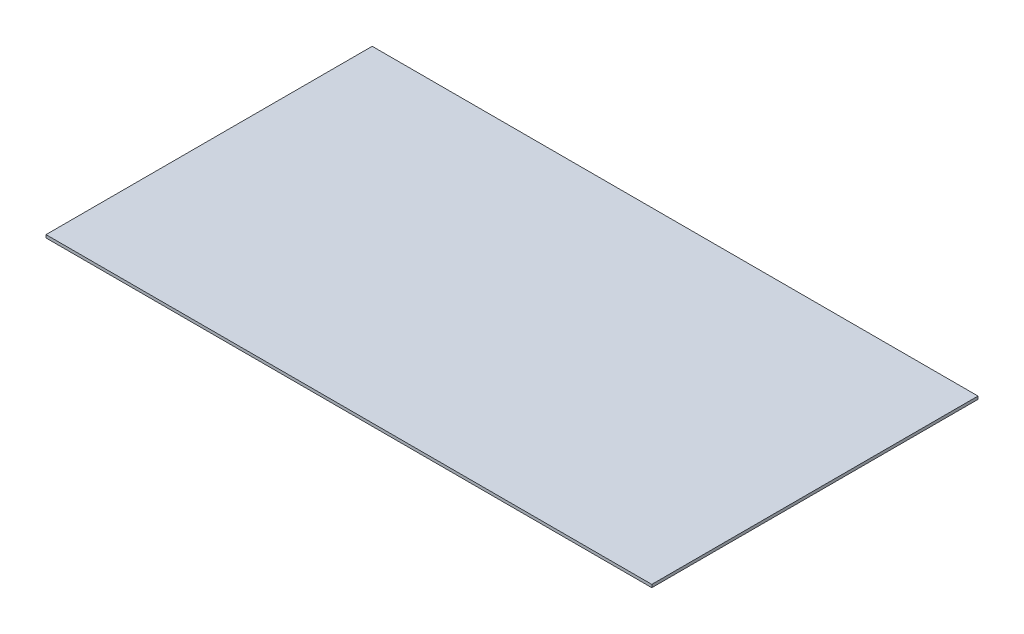
ISO-10303-21;
HEADER;
FILE_DESCRIPTION(('STEP AP214'),'2;1');
FILE_NAME('part.step','',(''),(''),'','','');
FILE_SCHEMA(('AUTOMOTIVE_DESIGN { 1 0 10303 214 1 1 1 1 }'));
ENDSEC;
DATA;
#1=APPLICATION_CONTEXT('core data for automotive mechanical design processes');
#2=APPLICATION_PROTOCOL_DEFINITION('international standard','automotive_design',2000,#1);
#3=PRODUCT_CONTEXT('',#1,'mechanical');
#4=PRODUCT('Part','Part','',(#3));
#5=PRODUCT_RELATED_PRODUCT_CATEGORY('part','',(#4));
#6=PRODUCT_DEFINITION_FORMATION('','',#4);
#7=PRODUCT_DEFINITION_CONTEXT('part definition',#1,'design');
#8=PRODUCT_DEFINITION('design','',#6,#7);
#9=PRODUCT_DEFINITION_SHAPE('','',#8);
#10=(LENGTH_UNIT() NAMED_UNIT(*) SI_UNIT(.MILLI.,.METRE.));
#11=(NAMED_UNIT(*) PLANE_ANGLE_UNIT() SI_UNIT($,.RADIAN.));
#12=(NAMED_UNIT(*) SI_UNIT($,.STERADIAN.) SOLID_ANGLE_UNIT());
#13=UNCERTAINTY_MEASURE_WITH_UNIT(LENGTH_MEASURE(1.E-05),#10,'distance_accuracy_value','');
#14=(GEOMETRIC_REPRESENTATION_CONTEXT(3) GLOBAL_UNCERTAINTY_ASSIGNED_CONTEXT((#13)) GLOBAL_UNIT_ASSIGNED_CONTEXT((#10,
#11,#12)) REPRESENTATION_CONTEXT('',''));
#15=CARTESIAN_POINT('',(0.,0.,0.));
#16=DIRECTION('',(0.,0.,1.));
#17=DIRECTION('',(1.,0.,0.));
#18=AXIS2_PLACEMENT_3D('',#15,#16,#17);
#19=CARTESIAN_POINT('',(0.,3.175,0.));
#20=DIRECTION('',(1.,0.,0.));
#21=DIRECTION('',(0.,0.,-1.));
#22=AXIS2_PLACEMENT_3D('',#19,#20,#21);
#23=PLANE('',#22);
#24=DIRECTION('',(0.,0.,1.));
#25=VECTOR('',#24,1.);
#26=CARTESIAN_POINT('',(0.,0.,0.));
#27=LINE('',#26,#25);
#28=CARTESIAN_POINT('',(0.,0.,-355.6));
#29=VERTEX_POINT('',#28);
#30=CARTESIAN_POINT('',(0.,0.,0.));
#31=VERTEX_POINT('',#30);
#32=EDGE_CURVE('E98',#29,#31,#27,.T.);
#33=ORIENTED_EDGE('',*,*,#32,.T.);
#34=DIRECTION('',(0.,-1.,0.));
#35=VECTOR('',#34,1.);
#36=CARTESIAN_POINT('',(0.,3.175,0.));
#37=LINE('',#36,#35);
#38=CARTESIAN_POINT('',(0.,3.175,0.));
#39=VERTEX_POINT('',#38);
#40=EDGE_CURVE('E11',#39,#31,#37,.T.);
#41=ORIENTED_EDGE('',*,*,#40,.F.);
#42=DIRECTION('',(0.,0.,1.));
#43=VECTOR('',#42,1.);
#44=CARTESIAN_POINT('',(0.,3.175,0.));
#45=LINE('',#44,#43);
#46=CARTESIAN_POINT('',(0.,3.175,-355.6));
#47=VERTEX_POINT('',#46);
#48=EDGE_CURVE('E86',#47,#39,#45,.T.);
#49=ORIENTED_EDGE('',*,*,#48,.F.);
#50=DIRECTION('',(0.,-1.,0.));
#51=VECTOR('',#50,1.);
#52=CARTESIAN_POINT('',(0.,3.175,-355.6));
#53=LINE('',#52,#51);
#54=EDGE_CURVE('E94',#47,#29,#53,.T.);
#55=ORIENTED_EDGE('',*,*,#54,.T.);
#56=EDGE_LOOP('',(#33,#41,#49,#55));
#57=FACE_BOUND('',#56,.T.);
#58=ADVANCED_FACE('F35',(#57),#23,.F.);
#59=CARTESIAN_POINT('',(0.,3.175,0.));
#60=DIRECTION('',(0.,0.,-1.));
#61=DIRECTION('',(-1.,0.,0.));
#62=AXIS2_PLACEMENT_3D('',#59,#60,#61);
#63=PLANE('',#62);
#64=DIRECTION('',(1.,0.,0.));
#65=VECTOR('',#64,1.);
#66=CARTESIAN_POINT('',(0.,0.,0.));
#67=LINE('',#66,#65);
#68=CARTESIAN_POINT('',(660.4,0.,0.));
#69=VERTEX_POINT('',#68);
#70=EDGE_CURVE('E90',#31,#69,#67,.T.);
#71=ORIENTED_EDGE('',*,*,#70,.T.);
#72=DIRECTION('',(0.,-1.,0.));
#73=VECTOR('',#72,1.);
#74=CARTESIAN_POINT('',(660.4,3.175,0.));
#75=LINE('',#74,#73);
#76=CARTESIAN_POINT('',(660.4,3.175,0.));
#77=VERTEX_POINT('',#76);
#78=EDGE_CURVE('E43',#77,#69,#75,.T.);
#79=ORIENTED_EDGE('',*,*,#78,.F.);
#80=DIRECTION('',(1.,0.,0.));
#81=VECTOR('',#80,1.);
#82=CARTESIAN_POINT('',(0.,3.175,0.));
#83=LINE('',#82,#81);
#84=EDGE_CURVE('E81',#39,#77,#83,.T.);
#85=ORIENTED_EDGE('',*,*,#84,.F.);
#86=ORIENTED_EDGE('',*,*,#40,.T.);
#87=EDGE_LOOP('',(#71,#79,#85,#86));
#88=FACE_BOUND('',#87,.T.);
#89=ADVANCED_FACE('F89',(#88),#63,.F.);
#90=CARTESIAN_POINT('',(660.4,3.175,0.));
#91=DIRECTION('',(-1.,0.,0.));
#92=DIRECTION('',(0.,0.,1.));
#93=AXIS2_PLACEMENT_3D('',#90,#91,#92);
#94=PLANE('',#93);
#95=DIRECTION('',(0.,0.,-1.));
#96=VECTOR('',#95,1.);
#97=CARTESIAN_POINT('',(660.4,0.,0.));
#98=LINE('',#97,#96);
#99=CARTESIAN_POINT('',(660.4,0.,-355.6));
#100=VERTEX_POINT('',#99);
#101=EDGE_CURVE('E68',#69,#100,#98,.T.);
#102=ORIENTED_EDGE('',*,*,#101,.T.);
#103=DIRECTION('',(0.,-1.,0.));
#104=VECTOR('',#103,1.);
#105=CARTESIAN_POINT('',(660.4,3.175,-355.6));
#106=LINE('',#105,#104);
#107=CARTESIAN_POINT('',(660.4,3.175,-355.6));
#108=VERTEX_POINT('',#107);
#109=EDGE_CURVE('E91',#108,#100,#106,.T.);
#110=ORIENTED_EDGE('',*,*,#109,.F.);
#111=DIRECTION('',(0.,0.,-1.));
#112=VECTOR('',#111,1.);
#113=CARTESIAN_POINT('',(660.4,3.175,0.));
#114=LINE('',#113,#112);
#115=EDGE_CURVE('E84',#77,#108,#114,.T.);
#116=ORIENTED_EDGE('',*,*,#115,.F.);
#117=ORIENTED_EDGE('',*,*,#78,.T.);
#118=EDGE_LOOP('',(#102,#110,#116,#117));
#119=FACE_BOUND('',#118,.T.);
#120=ADVANCED_FACE('F92',(#119),#94,.F.);
#121=CARTESIAN_POINT('',(0.,3.175,-355.6));
#122=DIRECTION('',(0.,0.,1.));
#123=DIRECTION('',(1.,0.,0.));
#124=AXIS2_PLACEMENT_3D('',#121,#122,#123);
#125=PLANE('',#124);
#126=DIRECTION('',(-1.,0.,0.));
#127=VECTOR('',#126,1.);
#128=CARTESIAN_POINT('',(0.,0.,-355.6));
#129=LINE('',#128,#127);
#130=EDGE_CURVE('E74',#100,#29,#129,.T.);
#131=ORIENTED_EDGE('',*,*,#130,.T.);
#132=ORIENTED_EDGE('',*,*,#54,.F.);
#133=DIRECTION('',(-1.,0.,0.));
#134=VECTOR('',#133,1.);
#135=CARTESIAN_POINT('',(0.,3.175,-355.6));
#136=LINE('',#135,#134);
#137=EDGE_CURVE('E51',#108,#47,#136,.T.);
#138=ORIENTED_EDGE('',*,*,#137,.F.);
#139=ORIENTED_EDGE('',*,*,#109,.T.);
#140=EDGE_LOOP('',(#131,#132,#138,#139));
#141=FACE_BOUND('',#140,.T.);
#142=ADVANCED_FACE('F105',(#141),#125,.F.);
#143=CARTESIAN_POINT('',(0.,3.175,0.));
#144=DIRECTION('',(0.,-1.,0.));
#145=DIRECTION('',(0.,0.,-1.));
#146=AXIS2_PLACEMENT_3D('',#143,#144,#145);
#147=PLANE('',#146);
#148=ORIENTED_EDGE('',*,*,#48,.T.);
#149=ORIENTED_EDGE('',*,*,#84,.T.);
#150=ORIENTED_EDGE('',*,*,#115,.T.);
#151=ORIENTED_EDGE('',*,*,#137,.T.);
#152=EDGE_LOOP('',(#148,#149,#150,#151));
#153=FACE_BOUND('',#152,.T.);
#154=ADVANCED_FACE('F82',(#153),#147,.F.);
#155=CARTESIAN_POINT('',(0.,0.,0.));
#156=DIRECTION('',(0.,-1.,0.));
#157=DIRECTION('',(0.,0.,-1.));
#158=AXIS2_PLACEMENT_3D('',#155,#156,#157);
#159=PLANE('',#158);
#160=ORIENTED_EDGE('',*,*,#32,.F.);
#161=ORIENTED_EDGE('',*,*,#130,.F.);
#162=ORIENTED_EDGE('',*,*,#101,.F.);
#163=ORIENTED_EDGE('',*,*,#70,.F.);
#164=EDGE_LOOP('',(#160,#161,#162,#163));
#165=FACE_BOUND('',#164,.T.);
#166=ADVANCED_FACE('F108',(#165),#159,.T.);
#167=CLOSED_SHELL('',(#58,#89,#120,#142,#154,#166));
#168=MANIFOLD_SOLID_BREP('B2',#167);
#169=ADVANCED_BREP_SHAPE_REPRESENTATION('',(#18,#168),#14);
#170=SHAPE_DEFINITION_REPRESENTATION(#9,#169);
ENDSEC;
END-ISO-10303-21;
